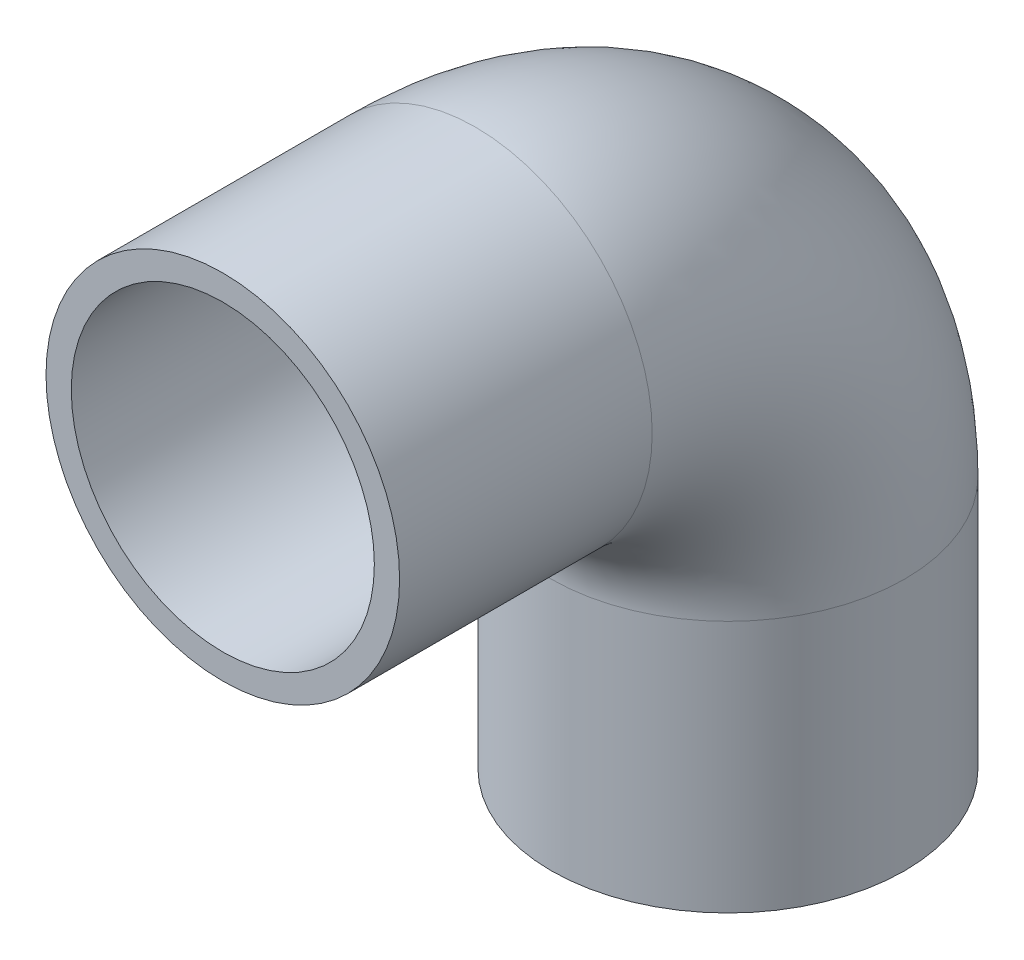
ISO-10303-21;
HEADER;
FILE_DESCRIPTION(('STEP AP214'),'2;1');
FILE_NAME('part.step','',(''),(''),'','','');
FILE_SCHEMA(('AUTOMOTIVE_DESIGN { 1 0 10303 214 1 1 1 1 }'));
ENDSEC;
DATA;
#1=APPLICATION_CONTEXT('core data for automotive mechanical design processes');
#2=APPLICATION_PROTOCOL_DEFINITION('international standard','automotive_design',2000,#1);
#3=PRODUCT_CONTEXT('',#1,'mechanical');
#4=PRODUCT('Part','Part','',(#3));
#5=PRODUCT_RELATED_PRODUCT_CATEGORY('part','',(#4));
#6=PRODUCT_DEFINITION_FORMATION('','',#4);
#7=PRODUCT_DEFINITION_CONTEXT('part definition',#1,'design');
#8=PRODUCT_DEFINITION('design','',#6,#7);
#9=PRODUCT_DEFINITION_SHAPE('','',#8);
#10=(LENGTH_UNIT() NAMED_UNIT(*) SI_UNIT(.MILLI.,.METRE.));
#11=(NAMED_UNIT(*) PLANE_ANGLE_UNIT() SI_UNIT($,.RADIAN.));
#12=(NAMED_UNIT(*) SI_UNIT($,.STERADIAN.) SOLID_ANGLE_UNIT());
#13=UNCERTAINTY_MEASURE_WITH_UNIT(LENGTH_MEASURE(1.E-05),#10,'distance_accuracy_value','');
#14=(GEOMETRIC_REPRESENTATION_CONTEXT(3) GLOBAL_UNCERTAINTY_ASSIGNED_CONTEXT((#13)) GLOBAL_UNIT_ASSIGNED_CONTEXT((#10,
#11,#12)) REPRESENTATION_CONTEXT('',''));
#15=CARTESIAN_POINT('',(0.,0.,0.));
#16=DIRECTION('',(0.,0.,1.));
#17=DIRECTION('',(1.,0.,0.));
#18=AXIS2_PLACEMENT_3D('',#15,#16,#17);
#19=CARTESIAN_POINT('',(0.,0.,0.));
#20=DIRECTION('',(0.,0.,1.));
#21=DIRECTION('',(1.,0.,0.));
#22=AXIS2_PLACEMENT_3D('',#19,#20,#21);
#23=PLANE('',#22);
#24=CARTESIAN_POINT('',(0.,0.,0.));
#25=DIRECTION('',(0.,0.,1.));
#26=DIRECTION('',(1.,0.,0.));
#27=AXIS2_PLACEMENT_3D('',#24,#25,#26);
#28=CIRCLE('',#27,6.);
#29=CARTESIAN_POINT('',(6.,0.,0.));
#30=VERTEX_POINT('',#29);
#31=EDGE_CURVE('E64',#30,#30,#28,.T.);
#32=ORIENTED_EDGE('',*,*,#31,.F.);
#33=EDGE_LOOP('',(#32));
#34=FACE_BOUND('',#33,.T.);
#35=CARTESIAN_POINT('',(0.,0.,0.));
#36=DIRECTION('',(0.,0.,1.));
#37=DIRECTION('',(1.,0.,0.));
#38=AXIS2_PLACEMENT_3D('',#35,#36,#37);
#39=CIRCLE('',#38,7.);
#40=CARTESIAN_POINT('',(7.,0.,0.));
#41=VERTEX_POINT('',#40);
#42=EDGE_CURVE('E54',#41,#41,#39,.T.);
#43=ORIENTED_EDGE('',*,*,#42,.T.);
#44=EDGE_LOOP('',(#43));
#45=FACE_BOUND('',#44,.T.);
#46=ADVANCED_FACE('F37',(#34,#45),#23,.T.);
#47=CARTESIAN_POINT('',(0.,-20.,-20.));
#48=DIRECTION('',(0.,1.,0.));
#49=DIRECTION('',(1.,0.,0.));
#50=AXIS2_PLACEMENT_3D('',#47,#48,#49);
#51=PLANE('',#50);
#52=CARTESIAN_POINT('',(0.,-20.,-20.));
#53=DIRECTION('',(0.,1.,0.));
#54=DIRECTION('',(0.,0.,1.));
#55=AXIS2_PLACEMENT_3D('',#52,#53,#54);
#56=CIRCLE('',#55,6.);
#57=CARTESIAN_POINT('',(0.,-20.,-14.));
#58=VERTEX_POINT('',#57);
#59=EDGE_CURVE('E60',#58,#58,#56,.T.);
#60=ORIENTED_EDGE('',*,*,#59,.T.);
#61=EDGE_LOOP('',(#60));
#62=FACE_BOUND('',#61,.T.);
#63=CARTESIAN_POINT('',(0.,-20.,-20.));
#64=DIRECTION('',(0.,1.,0.));
#65=DIRECTION('',(1.,0.,0.));
#66=AXIS2_PLACEMENT_3D('',#63,#64,#65);
#67=CIRCLE('',#66,7.);
#68=CARTESIAN_POINT('',(7.,-20.,-20.));
#69=VERTEX_POINT('',#68);
#70=EDGE_CURVE('E10',#69,#69,#67,.T.);
#71=ORIENTED_EDGE('',*,*,#70,.F.);
#72=EDGE_LOOP('',(#71));
#73=FACE_BOUND('',#72,.T.);
#74=ADVANCED_FACE('F94',(#62,#73),#51,.F.);
#75=CARTESIAN_POINT('',(0.,0.,0.));
#76=DIRECTION('',(0.,0.,-1.));
#77=DIRECTION('',(-1.,0.,0.));
#78=AXIS2_PLACEMENT_3D('',#75,#76,#77);
#79=CYLINDRICAL_SURFACE('',#78,7.);
#80=CARTESIAN_POINT('',(0.,0.,-9.99999999999993));
#81=DIRECTION('',(0.,0.,1.));
#82=DIRECTION('',(1.,0.,0.));
#83=AXIS2_PLACEMENT_3D('',#80,#81,#82);
#84=CIRCLE('',#83,7.);
#85=CARTESIAN_POINT('',(0.,7.,-9.99999999999988));
#86=VERTEX_POINT('',#85);
#87=EDGE_CURVE('E49',#86,#86,#84,.T.);
#88=ORIENTED_EDGE('',*,*,#87,.T.);
#89=EDGE_LOOP('',(#88));
#90=FACE_BOUND('',#89,.T.);
#91=ORIENTED_EDGE('',*,*,#42,.F.);
#92=EDGE_LOOP('',(#91));
#93=FACE_BOUND('',#92,.T.);
#94=ADVANCED_FACE('F97',(#90,#93),#79,.T.);
#95=CARTESIAN_POINT('',(0.,-10.,-10.));
#96=DIRECTION('',(-1.,0.,0.));
#97=DIRECTION('',(0.,0.,1.));
#98=AXIS2_PLACEMENT_3D('',#95,#96,#97);
#99=TOROIDAL_SURFACE('',#98,10.,7.);
#100=CARTESIAN_POINT('',(0.,-10.,-20.));
#101=DIRECTION('',(0.,1.,0.));
#102=DIRECTION('',(1.,0.,0.));
#103=AXIS2_PLACEMENT_3D('',#100,#101,#102);
#104=CIRCLE('',#103,7.);
#105=CARTESIAN_POINT('',(0.,-10.,-27.));
#106=VERTEX_POINT('',#105);
#107=EDGE_CURVE('E44',#106,#106,#104,.T.);
#108=CARTESIAN_POINT('',(0.,-10.,-10.));
#109=DIRECTION('',(-1.,0.,0.));
#110=DIRECTION('',(0.,0.,1.));
#111=AXIS2_PLACEMENT_3D('',#108,#109,#110);
#112=CIRCLE('',#111,17.);
#113=EDGE_CURVE('',#86,#106,#112,.T.);
#114=ORIENTED_EDGE('',*,*,#87,.F.);
#115=ORIENTED_EDGE('',*,*,#107,.T.);
#116=ORIENTED_EDGE('',*,*,#113,.T.);
#117=ORIENTED_EDGE('',*,*,#113,.F.);
#118=EDGE_LOOP('',(#114,#116,#115,#117));
#119=FACE_BOUND('',#118,.T.);
#120=ADVANCED_FACE('F99',(#119),#99,.T.);
#121=CARTESIAN_POINT('',(0.,-10.0000000000001,-20.));
#122=DIRECTION('',(0.,-1.,0.));
#123=DIRECTION('',(0.,0.,-1.));
#124=AXIS2_PLACEMENT_3D('',#121,#122,#123);
#125=CYLINDRICAL_SURFACE('',#124,7.);
#126=ORIENTED_EDGE('',*,*,#70,.T.);
#127=EDGE_LOOP('',(#126));
#128=FACE_BOUND('',#127,.T.);
#129=ORIENTED_EDGE('',*,*,#107,.F.);
#130=EDGE_LOOP('',(#129));
#131=FACE_BOUND('',#130,.T.);
#132=ADVANCED_FACE('F88',(#128,#131),#125,.T.);
#133=CARTESIAN_POINT('',(0.,0.,1.));
#134=DIRECTION('',(0.,0.,-1.));
#135=DIRECTION('',(-1.,0.,0.));
#136=AXIS2_PLACEMENT_3D('',#133,#134,#135);
#137=CYLINDRICAL_SURFACE('',#136,6.);
#138=CARTESIAN_POINT('',(0.,0.,-9.99999999999993));
#139=DIRECTION('',(0.,0.,1.));
#140=DIRECTION('',(1.,0.,0.));
#141=AXIS2_PLACEMENT_3D('',#138,#139,#140);
#142=CIRCLE('',#141,6.);
#143=CARTESIAN_POINT('',(0.,6.,-9.99999999999988));
#144=VERTEX_POINT('',#143);
#145=EDGE_CURVE('E69',#144,#144,#142,.T.);
#146=ORIENTED_EDGE('',*,*,#145,.F.);
#147=EDGE_LOOP('',(#146));
#148=FACE_BOUND('',#147,.T.);
#149=ORIENTED_EDGE('',*,*,#31,.T.);
#150=EDGE_LOOP('',(#149));
#151=FACE_BOUND('',#150,.T.);
#152=ADVANCED_FACE('F82',(#148,#151),#137,.F.);
#153=CARTESIAN_POINT('',(0.,-10.,-10.));
#154=DIRECTION('',(-1.,0.,0.));
#155=DIRECTION('',(0.,0.,1.));
#156=AXIS2_PLACEMENT_3D('',#153,#154,#155);
#157=TOROIDAL_SURFACE('',#156,10.,6.);
#158=CARTESIAN_POINT('',(0.,-10.,-20.));
#159=DIRECTION('',(0.,1.,0.));
#160=DIRECTION('',(1.,0.,0.));
#161=AXIS2_PLACEMENT_3D('',#158,#159,#160);
#162=CIRCLE('',#161,6.);
#163=CARTESIAN_POINT('',(0.,-10.,-26.));
#164=VERTEX_POINT('',#163);
#165=EDGE_CURVE('E68',#164,#164,#162,.T.);
#166=CARTESIAN_POINT('',(0.,-10.,-10.));
#167=DIRECTION('',(-1.,0.,0.));
#168=DIRECTION('',(0.,0.,1.));
#169=AXIS2_PLACEMENT_3D('',#166,#167,#168);
#170=CIRCLE('',#169,16.);
#171=EDGE_CURVE('',#144,#164,#170,.T.);
#172=ORIENTED_EDGE('',*,*,#145,.T.);
#173=ORIENTED_EDGE('',*,*,#165,.F.);
#174=ORIENTED_EDGE('',*,*,#171,.T.);
#175=ORIENTED_EDGE('',*,*,#171,.F.);
#176=EDGE_LOOP('',(#172,#174,#173,#175));
#177=FACE_BOUND('',#176,.T.);
#178=ADVANCED_FACE('F79',(#177),#157,.F.);
#179=CARTESIAN_POINT('',(0.,-10.,-20.));
#180=DIRECTION('',(0.,-1.,0.));
#181=DIRECTION('',(0.,0.,-1.));
#182=AXIS2_PLACEMENT_3D('',#179,#180,#181);
#183=CYLINDRICAL_SURFACE('',#182,6.);
#184=ORIENTED_EDGE('',*,*,#59,.F.);
#185=EDGE_LOOP('',(#184));
#186=FACE_BOUND('',#185,.T.);
#187=ORIENTED_EDGE('',*,*,#165,.T.);
#188=EDGE_LOOP('',(#187));
#189=FACE_BOUND('',#188,.T.);
#190=ADVANCED_FACE('F77',(#186,#189),#183,.F.);
#191=CLOSED_SHELL('',(#46,#74,#94,#120,#132,#152,#178,#190));
#192=MANIFOLD_SOLID_BREP('B2',#191);
#193=ADVANCED_BREP_SHAPE_REPRESENTATION('',(#18,#192),#14);
#194=SHAPE_DEFINITION_REPRESENTATION(#9,#193);
ENDSEC;
END-ISO-10303-21;
